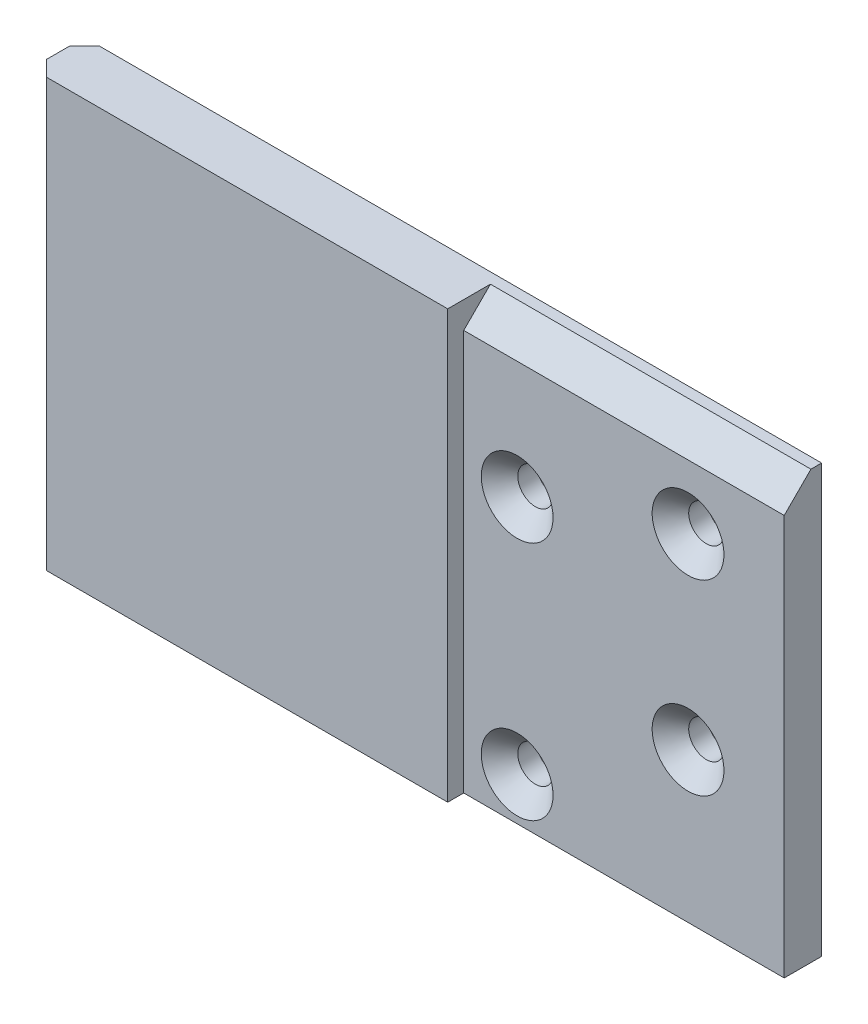
ISO-10303-21;
HEADER;
FILE_DESCRIPTION(('STEP AP214'),'2;1');
FILE_NAME('part.step','',(''),(''),'','','');
FILE_SCHEMA(('AUTOMOTIVE_DESIGN { 1 0 10303 214 1 1 1 1 }'));
ENDSEC;
DATA;
#1=APPLICATION_CONTEXT('core data for automotive mechanical design processes');
#2=APPLICATION_PROTOCOL_DEFINITION('international standard','automotive_design',2000,#1);
#3=PRODUCT_CONTEXT('',#1,'mechanical');
#4=PRODUCT('Part','Part','',(#3));
#5=PRODUCT_RELATED_PRODUCT_CATEGORY('part','',(#4));
#6=PRODUCT_DEFINITION_FORMATION('','',#4);
#7=PRODUCT_DEFINITION_CONTEXT('part definition',#1,'design');
#8=PRODUCT_DEFINITION('design','',#6,#7);
#9=PRODUCT_DEFINITION_SHAPE('','',#8);
#10=(LENGTH_UNIT() NAMED_UNIT(*) SI_UNIT(.MILLI.,.METRE.));
#11=(NAMED_UNIT(*) PLANE_ANGLE_UNIT() SI_UNIT($,.RADIAN.));
#12=(NAMED_UNIT(*) SI_UNIT($,.STERADIAN.) SOLID_ANGLE_UNIT());
#13=UNCERTAINTY_MEASURE_WITH_UNIT(LENGTH_MEASURE(1.E-05),#10,'distance_accuracy_value','');
#14=(GEOMETRIC_REPRESENTATION_CONTEXT(3) GLOBAL_UNCERTAINTY_ASSIGNED_CONTEXT((#13)) GLOBAL_UNIT_ASSIGNED_CONTEXT((#10,
#11,#12)) REPRESENTATION_CONTEXT('',''));
#15=CARTESIAN_POINT('',(0.,0.,0.));
#16=DIRECTION('',(0.,0.,1.));
#17=DIRECTION('',(1.,0.,0.));
#18=AXIS2_PLACEMENT_3D('',#15,#16,#17);
#19=CARTESIAN_POINT('',(-60.,80.,0.));
#20=DIRECTION('',(0.,0.,-1.));
#21=DIRECTION('',(-1.,0.,0.));
#22=AXIS2_PLACEMENT_3D('',#19,#20,#21);
#23=PLANE('',#22);
#24=CARTESIAN_POINT('',(-18.,63.,0.));
#25=DIRECTION('',(0.,0.,1.));
#26=DIRECTION('',(1.,0.,0.));
#27=AXIS2_PLACEMENT_3D('',#24,#25,#26);
#28=CIRCLE('',#27,6.72);
#29=CARTESIAN_POINT('',(-11.28,63.,0.));
#30=VERTEX_POINT('',#29);
#31=EDGE_CURVE('E271',#30,#30,#28,.T.);
#32=ORIENTED_EDGE('',*,*,#31,.F.);
#33=EDGE_LOOP('',(#32));
#34=FACE_BOUND('',#33,.T.);
#35=CARTESIAN_POINT('',(-50.,53.,0.));
#36=DIRECTION('',(0.,0.,1.));
#37=DIRECTION('',(1.,0.,0.));
#38=AXIS2_PLACEMENT_3D('',#35,#36,#37);
#39=CIRCLE('',#38,6.72);
#40=CARTESIAN_POINT('',(-43.28,53.,0.));
#41=VERTEX_POINT('',#40);
#42=EDGE_CURVE('E278',#41,#41,#39,.T.);
#43=ORIENTED_EDGE('',*,*,#42,.F.);
#44=EDGE_LOOP('',(#43));
#45=FACE_BOUND('',#44,.T.);
#46=CARTESIAN_POINT('',(-18.,28.,0.));
#47=DIRECTION('',(0.,0.,1.));
#48=DIRECTION('',(1.,0.,0.));
#49=AXIS2_PLACEMENT_3D('',#46,#47,#48);
#50=CIRCLE('',#49,6.72);
#51=CARTESIAN_POINT('',(-11.28,28.,0.));
#52=VERTEX_POINT('',#51);
#53=EDGE_CURVE('E287',#52,#52,#50,.T.);
#54=ORIENTED_EDGE('',*,*,#53,.F.);
#55=EDGE_LOOP('',(#54));
#56=FACE_BOUND('',#55,.T.);
#57=CARTESIAN_POINT('',(-50.,8.,0.));
#58=DIRECTION('',(0.,0.,1.));
#59=DIRECTION('',(1.,0.,0.));
#60=AXIS2_PLACEMENT_3D('',#57,#58,#59);
#61=CIRCLE('',#60,6.72);
#62=CARTESIAN_POINT('',(-43.28,8.,0.));
#63=VERTEX_POINT('',#62);
#64=EDGE_CURVE('E296',#63,#63,#61,.T.);
#65=ORIENTED_EDGE('',*,*,#64,.F.);
#66=EDGE_LOOP('',(#65));
#67=FACE_BOUND('',#66,.T.);
#68=DIRECTION('',(0.,-1.,0.));
#69=VECTOR('',#68,1.);
#70=CARTESIAN_POINT('',(0.,80.,0.));
#71=LINE('',#70,#69);
#72=CARTESIAN_POINT('',(0.,75.,0.));
#73=VERTEX_POINT('',#72);
#74=CARTESIAN_POINT('',(0.,0.,0.));
#75=VERTEX_POINT('',#74);
#76=EDGE_CURVE('E123',#73,#75,#71,.T.);
#77=ORIENTED_EDGE('',*,*,#76,.F.);
#78=DIRECTION('',(-1.,0.,0.));
#79=VECTOR('',#78,1.);
#80=CARTESIAN_POINT('',(-60.,75.,0.));
#81=LINE('',#80,#79);
#82=CARTESIAN_POINT('',(-60.,75.,0.));
#83=VERTEX_POINT('',#82);
#84=EDGE_CURVE('E45',#73,#83,#81,.T.);
#85=ORIENTED_EDGE('',*,*,#84,.T.);
#86=DIRECTION('',(0.,-1.,0.));
#87=VECTOR('',#86,1.);
#88=CARTESIAN_POINT('',(-60.,80.,0.));
#89=LINE('',#88,#87);
#90=CARTESIAN_POINT('',(-60.,0.,0.));
#91=VERTEX_POINT('',#90);
#92=EDGE_CURVE('E142',#83,#91,#89,.T.);
#93=ORIENTED_EDGE('',*,*,#92,.T.);
#94=DIRECTION('',(1.,0.,0.));
#95=VECTOR('',#94,1.);
#96=CARTESIAN_POINT('',(-60.,0.,0.));
#97=LINE('',#96,#95);
#98=EDGE_CURVE('E143',#91,#75,#97,.T.);
#99=ORIENTED_EDGE('',*,*,#98,.T.);
#100=EDGE_LOOP('',(#77,#85,#93,#99));
#101=FACE_BOUND('',#100,.T.);
#102=ADVANCED_FACE('F37',(#34,#45,#56,#67,#101),#23,.F.);
#103=CARTESIAN_POINT('',(0.,80.,0.));
#104=DIRECTION('',(-1.,0.,0.));
#105=DIRECTION('',(0.,0.,1.));
#106=AXIS2_PLACEMENT_3D('',#103,#104,#105);
#107=PLANE('',#106);
#108=DIRECTION('',(0.,0.,-1.));
#109=VECTOR('',#108,1.);
#110=CARTESIAN_POINT('',(0.,80.,0.));
#111=LINE('',#110,#109);
#112=CARTESIAN_POINT('',(0.,80.,-4.99999999999999));
#113=VERTEX_POINT('',#112);
#114=CARTESIAN_POINT('',(0.,80.,-7.));
#115=VERTEX_POINT('',#114);
#116=EDGE_CURVE('E106',#113,#115,#111,.T.);
#117=ORIENTED_EDGE('',*,*,#116,.F.);
#118=DIRECTION('',(0.,-0.707106781186549,0.707106781186547));
#119=VECTOR('',#118,1.);
#120=CARTESIAN_POINT('',(0.,80.,-4.99999999999999));
#121=LINE('',#120,#119);
#122=EDGE_CURVE('E59',#113,#73,#121,.T.);
#123=ORIENTED_EDGE('',*,*,#122,.T.);
#124=ORIENTED_EDGE('',*,*,#76,.T.);
#125=DIRECTION('',(0.,0.,-1.));
#126=VECTOR('',#125,1.);
#127=CARTESIAN_POINT('',(0.,0.,0.));
#128=LINE('',#127,#126);
#129=CARTESIAN_POINT('',(0.,0.,-7.));
#130=VERTEX_POINT('',#129);
#131=EDGE_CURVE('E120',#75,#130,#128,.T.);
#132=ORIENTED_EDGE('',*,*,#131,.T.);
#133=DIRECTION('',(0.,-1.,0.));
#134=VECTOR('',#133,1.);
#135=CARTESIAN_POINT('',(0.,80.,-7.));
#136=LINE('',#135,#134);
#137=EDGE_CURVE('E117',#115,#130,#136,.T.);
#138=ORIENTED_EDGE('',*,*,#137,.F.);
#139=EDGE_LOOP('',(#117,#123,#124,#132,#138));
#140=FACE_BOUND('',#139,.T.);
#141=ADVANCED_FACE('F118',(#140),#107,.F.);
#142=CARTESIAN_POINT('',(0.,80.,-7.));
#143=DIRECTION('',(0.,0.,1.));
#144=DIRECTION('',(1.,0.,0.));
#145=AXIS2_PLACEMENT_3D('',#142,#143,#144);
#146=PLANE('',#145);
#147=CARTESIAN_POINT('',(-18.,63.,-7.));
#148=DIRECTION('',(0.,0.,1.));
#149=DIRECTION('',(1.,0.,0.));
#150=AXIS2_PLACEMENT_3D('',#147,#148,#149);
#151=CIRCLE('',#150,3.3);
#152=CARTESIAN_POINT('',(-14.7,63.,-7.));
#153=VERTEX_POINT('',#152);
#154=EDGE_CURVE('E273',#153,#153,#151,.T.);
#155=ORIENTED_EDGE('',*,*,#154,.T.);
#156=EDGE_LOOP('',(#155));
#157=FACE_BOUND('',#156,.T.);
#158=CARTESIAN_POINT('',(-50.,53.,-7.));
#159=DIRECTION('',(0.,0.,1.));
#160=DIRECTION('',(1.,0.,0.));
#161=AXIS2_PLACEMENT_3D('',#158,#159,#160);
#162=CIRCLE('',#161,3.3);
#163=CARTESIAN_POINT('',(-46.7,53.,-7.));
#164=VERTEX_POINT('',#163);
#165=EDGE_CURVE('E284',#164,#164,#162,.T.);
#166=ORIENTED_EDGE('',*,*,#165,.T.);
#167=EDGE_LOOP('',(#166));
#168=FACE_BOUND('',#167,.T.);
#169=CARTESIAN_POINT('',(-18.,28.,-7.));
#170=DIRECTION('',(0.,0.,1.));
#171=DIRECTION('',(1.,0.,0.));
#172=AXIS2_PLACEMENT_3D('',#169,#170,#171);
#173=CIRCLE('',#172,3.3);
#174=CARTESIAN_POINT('',(-14.7,28.,-7.));
#175=VERTEX_POINT('',#174);
#176=EDGE_CURVE('E293',#175,#175,#173,.T.);
#177=ORIENTED_EDGE('',*,*,#176,.T.);
#178=EDGE_LOOP('',(#177));
#179=FACE_BOUND('',#178,.T.);
#180=CARTESIAN_POINT('',(-50.,8.,-7.));
#181=DIRECTION('',(0.,0.,1.));
#182=DIRECTION('',(1.,0.,0.));
#183=AXIS2_PLACEMENT_3D('',#180,#181,#182);
#184=CIRCLE('',#183,3.3);
#185=CARTESIAN_POINT('',(-46.7,8.,-7.));
#186=VERTEX_POINT('',#185);
#187=EDGE_CURVE('E146',#186,#186,#184,.T.);
#188=ORIENTED_EDGE('',*,*,#187,.T.);
#189=EDGE_LOOP('',(#188));
#190=FACE_BOUND('',#189,.T.);
#191=DIRECTION('',(-1.,0.,0.));
#192=VECTOR('',#191,1.);
#193=CARTESIAN_POINT('',(0.,0.,-7.));
#194=LINE('',#193,#192);
#195=CARTESIAN_POINT('',(-135.225243435751,0.,-6.99999999999998));
#196=VERTEX_POINT('',#195);
#197=EDGE_CURVE('E148',#130,#196,#194,.T.);
#198=ORIENTED_EDGE('',*,*,#197,.T.);
#199=DIRECTION('',(0.,-1.,0.));
#200=VECTOR('',#199,1.);
#201=CARTESIAN_POINT('',(-135.225243435751,80.,-6.99999999999998));
#202=LINE('',#201,#200);
#203=CARTESIAN_POINT('',(-135.225243435751,80.,-6.99999999999998));
#204=VERTEX_POINT('',#203);
#205=EDGE_CURVE('E124',#204,#196,#202,.T.);
#206=ORIENTED_EDGE('',*,*,#205,.F.);
#207=DIRECTION('',(-1.,0.,0.));
#208=VECTOR('',#207,1.);
#209=CARTESIAN_POINT('',(0.,80.,-7.));
#210=LINE('',#209,#208);
#211=EDGE_CURVE('E110',#115,#204,#210,.T.);
#212=ORIENTED_EDGE('',*,*,#211,.F.);
#213=ORIENTED_EDGE('',*,*,#137,.T.);
#214=EDGE_LOOP('',(#198,#206,#212,#213));
#215=FACE_BOUND('',#214,.T.);
#216=ADVANCED_FACE('F126',(#157,#168,#179,#190,#215),#146,.F.);
#217=CARTESIAN_POINT('',(-138.,80.,-4.22524343575088));
#218=DIRECTION('',(0.707106781186544,0.,0.707106781186552));
#219=DIRECTION('',(0.707106781186551,0.,-0.707106781186544));
#220=AXIS2_PLACEMENT_3D('',#217,#218,#219);
#221=PLANE('',#220);
#222=DIRECTION('',(-0.707106781186552,0.,0.707106781186544));
#223=VECTOR('',#222,1.);
#224=CARTESIAN_POINT('',(-138.,0.,-4.22524343575088));
#225=LINE('',#224,#223);
#226=CARTESIAN_POINT('',(-138.,0.,-4.22524343575088));
#227=VERTEX_POINT('',#226);
#228=EDGE_CURVE('E150',#196,#227,#225,.T.);
#229=ORIENTED_EDGE('',*,*,#228,.T.);
#230=DIRECTION('',(0.,-1.,0.));
#231=VECTOR('',#230,1.);
#232=CARTESIAN_POINT('',(-138.,80.,-4.22524343575088));
#233=LINE('',#232,#231);
#234=CARTESIAN_POINT('',(-138.,80.,-4.22524343575088));
#235=VERTEX_POINT('',#234);
#236=EDGE_CURVE('E170',#235,#227,#233,.T.);
#237=ORIENTED_EDGE('',*,*,#236,.F.);
#238=DIRECTION('',(-0.707106781186552,0.,0.707106781186544));
#239=VECTOR('',#238,1.);
#240=CARTESIAN_POINT('',(-138.,80.,-4.22524343575088));
#241=LINE('',#240,#239);
#242=EDGE_CURVE('E129',#204,#235,#241,.T.);
#243=ORIENTED_EDGE('',*,*,#242,.F.);
#244=ORIENTED_EDGE('',*,*,#205,.T.);
#245=EDGE_LOOP('',(#229,#237,#243,#244));
#246=FACE_BOUND('',#245,.T.);
#247=ADVANCED_FACE('F202',(#246),#221,.F.);
#248=CARTESIAN_POINT('',(-138.,80.,0.135644580554458));
#249=DIRECTION('',(1.,0.,0.));
#250=DIRECTION('',(0.,0.,-1.));
#251=AXIS2_PLACEMENT_3D('',#248,#249,#250);
#252=PLANE('',#251);
#253=DIRECTION('',(0.,0.,1.));
#254=VECTOR('',#253,1.);
#255=CARTESIAN_POINT('',(-138.,0.,0.135644580554458));
#256=LINE('',#255,#254);
#257=CARTESIAN_POINT('',(-138.,0.,0.135644580554458));
#258=VERTEX_POINT('',#257);
#259=EDGE_CURVE('E152',#227,#258,#256,.T.);
#260=ORIENTED_EDGE('',*,*,#259,.T.);
#261=DIRECTION('',(0.,-1.,0.));
#262=VECTOR('',#261,1.);
#263=CARTESIAN_POINT('',(-138.,80.,0.135644580554458));
#264=LINE('',#263,#262);
#265=CARTESIAN_POINT('',(-138.,80.,0.135644580554458));
#266=VERTEX_POINT('',#265);
#267=EDGE_CURVE('E167',#266,#258,#264,.T.);
#268=ORIENTED_EDGE('',*,*,#267,.F.);
#269=DIRECTION('',(0.,0.,1.));
#270=VECTOR('',#269,1.);
#271=CARTESIAN_POINT('',(-138.,80.,0.135644580554458));
#272=LINE('',#271,#270);
#273=EDGE_CURVE('E131',#235,#266,#272,.T.);
#274=ORIENTED_EDGE('',*,*,#273,.F.);
#275=ORIENTED_EDGE('',*,*,#236,.T.);
#276=EDGE_LOOP('',(#260,#268,#274,#275));
#277=FACE_BOUND('',#276,.T.);
#278=ADVANCED_FACE('F199',(#277),#252,.F.);
#279=CARTESIAN_POINT('',(-138.,80.,0.135644580554458));
#280=DIRECTION('',(0.707106781186549,0.,-0.707106781186546));
#281=DIRECTION('',(-0.707106781186546,0.,-0.707106781186549));
#282=AXIS2_PLACEMENT_3D('',#279,#280,#281);
#283=PLANE('',#282);
#284=DIRECTION('',(0.707106781186546,0.,0.707106781186549));
#285=VECTOR('',#284,1.);
#286=CARTESIAN_POINT('',(-138.,0.,0.135644580554458));
#287=LINE('',#286,#285);
#288=CARTESIAN_POINT('',(-135.135644580554,0.,3.00000000000002));
#289=VERTEX_POINT('',#288);
#290=EDGE_CURVE('E154',#258,#289,#287,.T.);
#291=ORIENTED_EDGE('',*,*,#290,.T.);
#292=DIRECTION('',(0.,-1.,0.));
#293=VECTOR('',#292,1.);
#294=CARTESIAN_POINT('',(-135.135644580554,80.,3.00000000000002));
#295=LINE('',#294,#293);
#296=CARTESIAN_POINT('',(-135.135644580554,80.,3.00000000000002));
#297=VERTEX_POINT('',#296);
#298=EDGE_CURVE('E164',#297,#289,#295,.T.);
#299=ORIENTED_EDGE('',*,*,#298,.F.);
#300=DIRECTION('',(0.707106781186546,0.,0.707106781186549));
#301=VECTOR('',#300,1.);
#302=CARTESIAN_POINT('',(-138.,80.,0.135644580554458));
#303=LINE('',#302,#301);
#304=EDGE_CURVE('E136',#266,#297,#303,.T.);
#305=ORIENTED_EDGE('',*,*,#304,.F.);
#306=ORIENTED_EDGE('',*,*,#267,.T.);
#307=EDGE_LOOP('',(#291,#299,#305,#306));
#308=FACE_BOUND('',#307,.T.);
#309=ADVANCED_FACE('F195',(#308),#283,.F.);
#310=CARTESIAN_POINT('',(-135.135644580554,80.,3.00000000000002));
#311=DIRECTION('',(0.,0.,-1.));
#312=DIRECTION('',(-1.,0.,0.));
#313=AXIS2_PLACEMENT_3D('',#310,#311,#312);
#314=PLANE('',#313);
#315=DIRECTION('',(1.,0.,0.));
#316=VECTOR('',#315,1.);
#317=CARTESIAN_POINT('',(-135.135644580554,0.,3.00000000000002));
#318=LINE('',#317,#316);
#319=CARTESIAN_POINT('',(-60.,0.,3.00000000000002));
#320=VERTEX_POINT('',#319);
#321=EDGE_CURVE('E156',#289,#320,#318,.T.);
#322=ORIENTED_EDGE('',*,*,#321,.T.);
#323=DIRECTION('',(0.,-1.,0.));
#324=VECTOR('',#323,1.);
#325=CARTESIAN_POINT('',(-60.,80.,3.00000000000002));
#326=LINE('',#325,#324);
#327=CARTESIAN_POINT('',(-60.,80.,3.00000000000002));
#328=VERTEX_POINT('',#327);
#329=EDGE_CURVE('E161',#328,#320,#326,.T.);
#330=ORIENTED_EDGE('',*,*,#329,.F.);
#331=DIRECTION('',(1.,0.,0.));
#332=VECTOR('',#331,1.);
#333=CARTESIAN_POINT('',(-135.135644580554,80.,3.00000000000002));
#334=LINE('',#333,#332);
#335=EDGE_CURVE('E138',#297,#328,#334,.T.);
#336=ORIENTED_EDGE('',*,*,#335,.F.);
#337=ORIENTED_EDGE('',*,*,#298,.T.);
#338=EDGE_LOOP('',(#322,#330,#336,#337));
#339=FACE_BOUND('',#338,.T.);
#340=ADVANCED_FACE('F190',(#339),#314,.F.);
#341=CARTESIAN_POINT('',(-60.,80.,3.00000000000002));
#342=DIRECTION('',(-1.,0.,0.));
#343=DIRECTION('',(0.,0.,1.));
#344=AXIS2_PLACEMENT_3D('',#341,#342,#343);
#345=PLANE('',#344);
#346=DIRECTION('',(0.,0.,-1.));
#347=VECTOR('',#346,1.);
#348=CARTESIAN_POINT('',(-60.,0.,3.00000000000002));
#349=LINE('',#348,#347);
#350=EDGE_CURVE('E114',#320,#91,#349,.T.);
#351=ORIENTED_EDGE('',*,*,#350,.T.);
#352=ORIENTED_EDGE('',*,*,#92,.F.);
#353=DIRECTION('',(0.,0.707106781186549,-0.707106781186547));
#354=VECTOR('',#353,1.);
#355=CARTESIAN_POINT('',(-60.,76.,-0.999999999999998));
#356=LINE('',#355,#354);
#357=CARTESIAN_POINT('',(-60.,80.,-4.99999999999999));
#358=VERTEX_POINT('',#357);
#359=EDGE_CURVE('E11',#83,#358,#356,.T.);
#360=ORIENTED_EDGE('',*,*,#359,.T.);
#361=DIRECTION('',(0.,0.,-1.));
#362=VECTOR('',#361,1.);
#363=CARTESIAN_POINT('',(-60.,80.,3.00000000000002));
#364=LINE('',#363,#362);
#365=EDGE_CURVE('E140',#328,#358,#364,.T.);
#366=ORIENTED_EDGE('',*,*,#365,.F.);
#367=ORIENTED_EDGE('',*,*,#329,.T.);
#368=EDGE_LOOP('',(#351,#352,#360,#366,#367));
#369=FACE_BOUND('',#368,.T.);
#370=ADVANCED_FACE('F183',(#369),#345,.F.);
#371=CARTESIAN_POINT('',(0.,80.,0.));
#372=DIRECTION('',(0.,1.,0.));
#373=DIRECTION('',(0.,0.,1.));
#374=AXIS2_PLACEMENT_3D('',#371,#372,#373);
#375=PLANE('',#374);
#376=ORIENTED_EDGE('',*,*,#365,.T.);
#377=DIRECTION('',(1.,0.,0.));
#378=VECTOR('',#377,1.);
#379=CARTESIAN_POINT('',(0.,80.,-4.99999999999999));
#380=LINE('',#379,#378);
#381=EDGE_CURVE('E113',#358,#113,#380,.T.);
#382=ORIENTED_EDGE('',*,*,#381,.T.);
#383=ORIENTED_EDGE('',*,*,#116,.T.);
#384=ORIENTED_EDGE('',*,*,#211,.T.);
#385=ORIENTED_EDGE('',*,*,#242,.T.);
#386=ORIENTED_EDGE('',*,*,#273,.T.);
#387=ORIENTED_EDGE('',*,*,#304,.T.);
#388=ORIENTED_EDGE('',*,*,#335,.T.);
#389=EDGE_LOOP('',(#376,#382,#383,#384,#385,#386,#387,#388));
#390=FACE_BOUND('',#389,.T.);
#391=ADVANCED_FACE('F108',(#390),#375,.T.);
#392=CARTESIAN_POINT('',(0.,0.,0.));
#393=DIRECTION('',(0.,1.,0.));
#394=DIRECTION('',(0.,0.,1.));
#395=AXIS2_PLACEMENT_3D('',#392,#393,#394);
#396=PLANE('',#395);
#397=ORIENTED_EDGE('',*,*,#98,.F.);
#398=ORIENTED_EDGE('',*,*,#350,.F.);
#399=ORIENTED_EDGE('',*,*,#321,.F.);
#400=ORIENTED_EDGE('',*,*,#290,.F.);
#401=ORIENTED_EDGE('',*,*,#259,.F.);
#402=ORIENTED_EDGE('',*,*,#228,.F.);
#403=ORIENTED_EDGE('',*,*,#197,.F.);
#404=ORIENTED_EDGE('',*,*,#131,.F.);
#405=EDGE_LOOP('',(#397,#398,#399,#400,#401,#402,#403,#404));
#406=FACE_BOUND('',#405,.T.);
#407=ADVANCED_FACE('F178',(#406),#396,.F.);
#408=CARTESIAN_POINT('',(0.,80.,-4.99999999999999));
#409=DIRECTION('',(0.,0.707106781186546,0.707106781186548));
#410=DIRECTION('',(-1.,0.,0.));
#411=AXIS2_PLACEMENT_3D('',#408,#409,#410);
#412=PLANE('',#411);
#413=ORIENTED_EDGE('',*,*,#359,.F.);
#414=ORIENTED_EDGE('',*,*,#84,.F.);
#415=ORIENTED_EDGE('',*,*,#122,.F.);
#416=ORIENTED_EDGE('',*,*,#381,.F.);
#417=EDGE_LOOP('',(#413,#414,#415,#416));
#418=FACE_BOUND('',#417,.T.);
#419=ADVANCED_FACE('F39',(#418),#412,.T.);
#420=CARTESIAN_POINT('',(-50.,8.,0.));
#421=DIRECTION('',(0.,0.,1.));
#422=DIRECTION('',(1.,0.,0.));
#423=AXIS2_PLACEMENT_3D('',#420,#421,#422);
#424=CYLINDRICAL_SURFACE('',#423,3.29999999999999);
#425=ORIENTED_EDGE('',*,*,#187,.F.);
#426=EDGE_LOOP('',(#425));
#427=FACE_BOUND('',#426,.T.);
#428=CARTESIAN_POINT('',(-50.,8.,-3.42000000000002));
#429=DIRECTION('',(0.,0.,1.));
#430=DIRECTION('',(1.,0.,0.));
#431=AXIS2_PLACEMENT_3D('',#428,#429,#430);
#432=CIRCLE('',#431,3.29999999999998);
#433=CARTESIAN_POINT('',(-46.7,8.,-3.42000000000002));
#434=VERTEX_POINT('',#433);
#435=EDGE_CURVE('E299',#434,#434,#432,.T.);
#436=ORIENTED_EDGE('',*,*,#435,.T.);
#437=EDGE_LOOP('',(#436));
#438=FACE_BOUND('',#437,.T.);
#439=ADVANCED_FACE('F205',(#427,#438),#424,.F.);
#440=CARTESIAN_POINT('',(-50.,8.,0.));
#441=DIRECTION('',(0.,0.,1.));
#442=DIRECTION('',(1.,0.,0.));
#443=AXIS2_PLACEMENT_3D('',#440,#441,#442);
#444=CONICAL_SURFACE('',#443,6.72,0.785398163397448);
#445=ORIENTED_EDGE('',*,*,#435,.F.);
#446=EDGE_LOOP('',(#445));
#447=FACE_BOUND('',#446,.T.);
#448=ORIENTED_EDGE('',*,*,#64,.T.);
#449=EDGE_LOOP('',(#448));
#450=FACE_BOUND('',#449,.T.);
#451=ADVANCED_FACE('F210',(#447,#450),#444,.F.);
#452=CARTESIAN_POINT('',(-18.,28.,0.));
#453=DIRECTION('',(0.,0.,1.));
#454=DIRECTION('',(1.,0.,0.));
#455=AXIS2_PLACEMENT_3D('',#452,#453,#454);
#456=CYLINDRICAL_SURFACE('',#455,3.29999999999999);
#457=ORIENTED_EDGE('',*,*,#176,.F.);
#458=EDGE_LOOP('',(#457));
#459=FACE_BOUND('',#458,.T.);
#460=CARTESIAN_POINT('',(-18.,28.,-3.42000000000002));
#461=DIRECTION('',(0.,0.,1.));
#462=DIRECTION('',(1.,0.,0.));
#463=AXIS2_PLACEMENT_3D('',#460,#461,#462);
#464=CIRCLE('',#463,3.29999999999999);
#465=CARTESIAN_POINT('',(-14.7,28.,-3.42000000000002));
#466=VERTEX_POINT('',#465);
#467=EDGE_CURVE('E290',#466,#466,#464,.T.);
#468=ORIENTED_EDGE('',*,*,#467,.T.);
#469=EDGE_LOOP('',(#468));
#470=FACE_BOUND('',#469,.T.);
#471=ADVANCED_FACE('F240',(#459,#470),#456,.F.);
#472=CARTESIAN_POINT('',(-18.,28.,0.));
#473=DIRECTION('',(0.,0.,1.));
#474=DIRECTION('',(1.,0.,0.));
#475=AXIS2_PLACEMENT_3D('',#472,#473,#474);
#476=CONICAL_SURFACE('',#475,6.72,0.785398163397447);
#477=ORIENTED_EDGE('',*,*,#467,.F.);
#478=EDGE_LOOP('',(#477));
#479=FACE_BOUND('',#478,.T.);
#480=ORIENTED_EDGE('',*,*,#53,.T.);
#481=EDGE_LOOP('',(#480));
#482=FACE_BOUND('',#481,.T.);
#483=ADVANCED_FACE('F244',(#479,#482),#476,.F.);
#484=CARTESIAN_POINT('',(-50.,53.,0.));
#485=DIRECTION('',(0.,0.,1.));
#486=DIRECTION('',(1.,0.,0.));
#487=AXIS2_PLACEMENT_3D('',#484,#485,#486);
#488=CYLINDRICAL_SURFACE('',#487,3.29999999999999);
#489=ORIENTED_EDGE('',*,*,#165,.F.);
#490=EDGE_LOOP('',(#489));
#491=FACE_BOUND('',#490,.T.);
#492=CARTESIAN_POINT('',(-50.,53.,-3.42000000000002));
#493=DIRECTION('',(0.,0.,1.));
#494=DIRECTION('',(1.,0.,0.));
#495=AXIS2_PLACEMENT_3D('',#492,#493,#494);
#496=CIRCLE('',#495,3.29999999999998);
#497=CARTESIAN_POINT('',(-46.7,53.,-3.42000000000002));
#498=VERTEX_POINT('',#497);
#499=EDGE_CURVE('E281',#498,#498,#496,.T.);
#500=ORIENTED_EDGE('',*,*,#499,.T.);
#501=EDGE_LOOP('',(#500));
#502=FACE_BOUND('',#501,.T.);
#503=ADVANCED_FACE('F248',(#491,#502),#488,.F.);
#504=CARTESIAN_POINT('',(-50.,53.,0.));
#505=DIRECTION('',(0.,0.,1.));
#506=DIRECTION('',(1.,0.,0.));
#507=AXIS2_PLACEMENT_3D('',#504,#505,#506);
#508=CONICAL_SURFACE('',#507,6.72,0.785398163397448);
#509=ORIENTED_EDGE('',*,*,#499,.F.);
#510=EDGE_LOOP('',(#509));
#511=FACE_BOUND('',#510,.T.);
#512=ORIENTED_EDGE('',*,*,#42,.T.);
#513=EDGE_LOOP('',(#512));
#514=FACE_BOUND('',#513,.T.);
#515=ADVANCED_FACE('F252',(#511,#514),#508,.F.);
#516=CARTESIAN_POINT('',(-18.,63.,0.));
#517=DIRECTION('',(0.,0.,1.));
#518=DIRECTION('',(1.,0.,0.));
#519=AXIS2_PLACEMENT_3D('',#516,#517,#518);
#520=CYLINDRICAL_SURFACE('',#519,3.29999999999999);
#521=ORIENTED_EDGE('',*,*,#154,.F.);
#522=EDGE_LOOP('',(#521));
#523=FACE_BOUND('',#522,.T.);
#524=CARTESIAN_POINT('',(-18.,63.,-3.42000000000002));
#525=DIRECTION('',(0.,0.,1.));
#526=DIRECTION('',(1.,0.,0.));
#527=AXIS2_PLACEMENT_3D('',#524,#525,#526);
#528=CIRCLE('',#527,3.29999999999999);
#529=CARTESIAN_POINT('',(-14.7,63.,-3.42000000000002));
#530=VERTEX_POINT('',#529);
#531=EDGE_CURVE('E269',#530,#530,#528,.T.);
#532=ORIENTED_EDGE('',*,*,#531,.T.);
#533=EDGE_LOOP('',(#532));
#534=FACE_BOUND('',#533,.T.);
#535=ADVANCED_FACE('F256',(#523,#534),#520,.F.);
#536=CARTESIAN_POINT('',(-18.,63.,0.));
#537=DIRECTION('',(0.,0.,1.));
#538=DIRECTION('',(1.,0.,0.));
#539=AXIS2_PLACEMENT_3D('',#536,#537,#538);
#540=CONICAL_SURFACE('',#539,6.72,0.785398163397447);
#541=ORIENTED_EDGE('',*,*,#531,.F.);
#542=EDGE_LOOP('',(#541));
#543=FACE_BOUND('',#542,.T.);
#544=ORIENTED_EDGE('',*,*,#31,.T.);
#545=EDGE_LOOP('',(#544));
#546=FACE_BOUND('',#545,.T.);
#547=ADVANCED_FACE('F260',(#543,#546),#540,.F.);
#548=CLOSED_SHELL('',(#102,#141,#216,#247,#278,#309,#340,#370,#391,#407,#419,#439,#451,#471,
#483,#503,#515,#535,#547));
#549=MANIFOLD_SOLID_BREP('B2',#548);
#550=ADVANCED_BREP_SHAPE_REPRESENTATION('',(#18,#549),#14);
#551=SHAPE_DEFINITION_REPRESENTATION(#9,#550);
ENDSEC;
END-ISO-10303-21;
